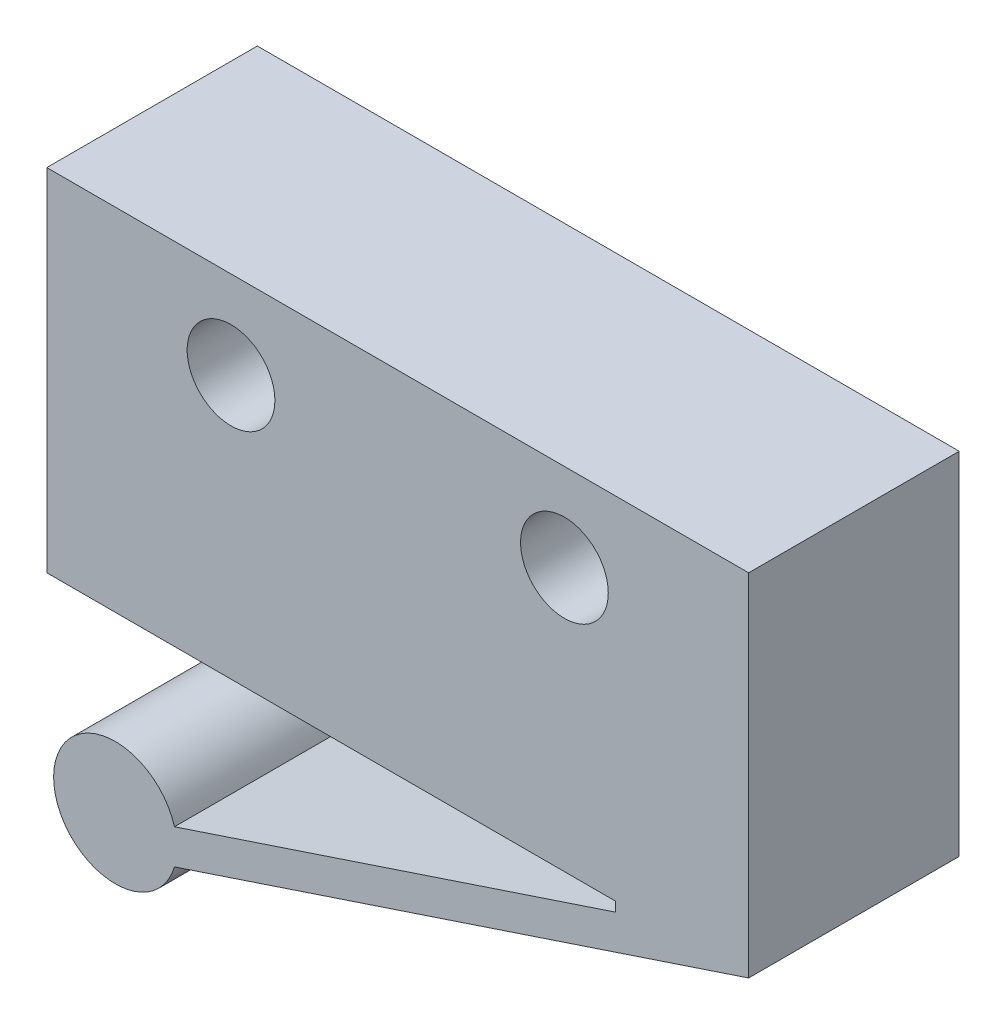
ISO-10303-21;
HEADER;
FILE_DESCRIPTION(('STEP AP214'),'2;1');
FILE_NAME('part.step','',(''),(''),'','','');
FILE_SCHEMA(('AUTOMOTIVE_DESIGN { 1 0 10303 214 1 1 1 1 }'));
ENDSEC;
DATA;
#1=APPLICATION_CONTEXT('core data for automotive mechanical design processes');
#2=APPLICATION_PROTOCOL_DEFINITION('international standard','automotive_design',2000,#1);
#3=PRODUCT_CONTEXT('',#1,'mechanical');
#4=PRODUCT('Part','Part','',(#3));
#5=PRODUCT_RELATED_PRODUCT_CATEGORY('part','',(#4));
#6=PRODUCT_DEFINITION_FORMATION('','',#4);
#7=PRODUCT_DEFINITION_CONTEXT('part definition',#1,'design');
#8=PRODUCT_DEFINITION('design','',#6,#7);
#9=PRODUCT_DEFINITION_SHAPE('','',#8);
#10=(LENGTH_UNIT() NAMED_UNIT(*) SI_UNIT(.MILLI.,.METRE.));
#11=(NAMED_UNIT(*) PLANE_ANGLE_UNIT() SI_UNIT($,.RADIAN.));
#12=(NAMED_UNIT(*) SI_UNIT($,.STERADIAN.) SOLID_ANGLE_UNIT());
#13=UNCERTAINTY_MEASURE_WITH_UNIT(LENGTH_MEASURE(1.E-05),#10,'distance_accuracy_value','');
#14=(GEOMETRIC_REPRESENTATION_CONTEXT(3) GLOBAL_UNCERTAINTY_ASSIGNED_CONTEXT((#13)) GLOBAL_UNIT_ASSIGNED_CONTEXT((#10,
#11,#12)) REPRESENTATION_CONTEXT('',''));
#15=CARTESIAN_POINT('',(0.,0.,0.));
#16=DIRECTION('',(0.,0.,1.));
#17=DIRECTION('',(1.,0.,0.));
#18=AXIS2_PLACEMENT_3D('',#15,#16,#17);
#19=CARTESIAN_POINT('',(-18.0482362713633,-14.9432240988429,6.));
#20=DIRECTION('',(0.,0.,1.));
#21=DIRECTION('',(1.,0.,0.));
#22=AXIS2_PLACEMENT_3D('',#19,#20,#21);
#23=PLANE('',#22);
#24=CARTESIAN_POINT('',(-14.75,-2.5,6.));
#25=DIRECTION('',(0.,0.,1.));
#26=DIRECTION('',(1.,0.,0.));
#27=AXIS2_PLACEMENT_3D('',#24,#25,#26);
#28=CIRCLE('',#27,1.25);
#29=CARTESIAN_POINT('',(-13.5,-2.5,6.));
#30=VERTEX_POINT('',#29);
#31=EDGE_CURVE('E135',#30,#30,#28,.T.);
#32=ORIENTED_EDGE('',*,*,#31,.F.);
#33=EDGE_LOOP('',(#32));
#34=FACE_BOUND('',#33,.T.);
#35=DIRECTION('',(0.,1.,0.));
#36=VECTOR('',#35,1.);
#37=CARTESIAN_POINT('',(0.,0.,6.));
#38=LINE('',#37,#36);
#39=CARTESIAN_POINT('',(0.,-10.,6.));
#40=VERTEX_POINT('',#39);
#41=CARTESIAN_POINT('',(0.,0.,6.));
#42=VERTEX_POINT('',#41);
#43=EDGE_CURVE('E146',#40,#42,#38,.T.);
#44=ORIENTED_EDGE('',*,*,#43,.T.);
#45=DIRECTION('',(-1.,0.,0.));
#46=VECTOR('',#45,1.);
#47=CARTESIAN_POINT('',(0.,0.,6.));
#48=LINE('',#47,#46);
#49=CARTESIAN_POINT('',(-20.,0.,6.));
#50=VERTEX_POINT('',#49);
#51=EDGE_CURVE('E94',#42,#50,#48,.T.);
#52=ORIENTED_EDGE('',*,*,#51,.T.);
#53=DIRECTION('',(0.,-1.,0.));
#54=VECTOR('',#53,1.);
#55=CARTESIAN_POINT('',(-20.,0.,6.));
#56=LINE('',#55,#54);
#57=CARTESIAN_POINT('',(-20.,-10.,6.));
#58=VERTEX_POINT('',#57);
#59=EDGE_CURVE('E161',#50,#58,#56,.T.);
#60=ORIENTED_EDGE('',*,*,#59,.T.);
#61=DIRECTION('',(1.,0.,0.));
#62=VECTOR('',#61,1.);
#63=CARTESIAN_POINT('',(-20.,-10.,6.));
#64=LINE('',#63,#62);
#65=CARTESIAN_POINT('',(-3.79315389070532,-10.,6.));
#66=VERTEX_POINT('',#65);
#67=EDGE_CURVE('E174',#58,#66,#64,.T.);
#68=ORIENTED_EDGE('',*,*,#67,.T.);
#69=DIRECTION('',(0.,-1.,0.));
#70=VECTOR('',#69,1.);
#71=CARTESIAN_POINT('',(-3.79315389070532,-10.,6.));
#72=LINE('',#71,#70);
#73=CARTESIAN_POINT('',(-3.79315389070532,-10.2709826001204,6.));
#74=VERTEX_POINT('',#73);
#75=EDGE_CURVE('E113',#66,#74,#72,.T.);
#76=ORIENTED_EDGE('',*,*,#75,.T.);
#77=DIRECTION('',(-0.948951208735798,-0.315422896186799,0.));
#78=VECTOR('',#77,1.);
#79=CARTESIAN_POINT('',(-3.79315389070532,-10.2709826001204,6.));
#80=LINE('',#79,#78);
#81=CARTESIAN_POINT('',(-16.3617348211214,-14.4486665121431,6.));
#82=VERTEX_POINT('',#81);
#83=EDGE_CURVE('E107',#74,#82,#80,.T.);
#84=ORIENTED_EDGE('',*,*,#83,.T.);
#85=CARTESIAN_POINT('',(-18.0482362713633,-14.9432240988429,6.));
#86=DIRECTION('',(0.,0.,1.));
#87=DIRECTION('',(1.,0.,0.));
#88=AXIS2_PLACEMENT_3D('',#85,#86,#87);
#89=CIRCLE('',#88,1.75751937350073);
#90=CARTESIAN_POINT('',(-16.361966597714,-15.4385713870769,6.));
#91=VERTEX_POINT('',#90);
#92=EDGE_CURVE('E111',#82,#91,#89,.T.);
#93=ORIENTED_EDGE('',*,*,#92,.T.);
#94=DIRECTION('',(0.948951208735798,0.315422896186799,0.));
#95=VECTOR('',#94,1.);
#96=CARTESIAN_POINT('',(-16.361966597714,-15.4385713870769,6.));
#97=LINE('',#96,#95);
#98=EDGE_CURVE('E51',#91,#40,#97,.T.);
#99=ORIENTED_EDGE('',*,*,#98,.T.);
#100=EDGE_LOOP('',(#44,#52,#60,#68,#76,#84,#93,#99));
#101=FACE_BOUND('',#100,.T.);
#102=CARTESIAN_POINT('',(-5.25,-2.5,6.));
#103=DIRECTION('',(0.,0.,1.));
#104=DIRECTION('',(1.,0.,0.));
#105=AXIS2_PLACEMENT_3D('',#102,#103,#104);
#106=CIRCLE('',#105,1.25);
#107=CARTESIAN_POINT('',(-4.,-2.5,6.));
#108=VERTEX_POINT('',#107);
#109=EDGE_CURVE('E183',#108,#108,#106,.T.);
#110=ORIENTED_EDGE('',*,*,#109,.F.);
#111=EDGE_LOOP('',(#110));
#112=FACE_BOUND('',#111,.T.);
#113=ADVANCED_FACE('F34',(#34,#101,#112),#23,.T.);
#114=CARTESIAN_POINT('',(-18.0482362713633,-14.9432240988429,0.));
#115=DIRECTION('',(0.,0.,1.));
#116=DIRECTION('',(1.,0.,0.));
#117=AXIS2_PLACEMENT_3D('',#114,#115,#116);
#118=PLANE('',#117);
#119=CARTESIAN_POINT('',(-14.75,-2.5,0.));
#120=DIRECTION('',(0.,0.,1.));
#121=DIRECTION('',(1.,0.,0.));
#122=AXIS2_PLACEMENT_3D('',#119,#120,#121);
#123=CIRCLE('',#122,1.25);
#124=CARTESIAN_POINT('',(-13.5,-2.5,0.));
#125=VERTEX_POINT('',#124);
#126=EDGE_CURVE('E180',#125,#125,#123,.T.);
#127=ORIENTED_EDGE('',*,*,#126,.T.);
#128=EDGE_LOOP('',(#127));
#129=FACE_BOUND('',#128,.T.);
#130=DIRECTION('',(0.,1.,0.));
#131=VECTOR('',#130,1.);
#132=CARTESIAN_POINT('',(0.,0.,0.));
#133=LINE('',#132,#131);
#134=CARTESIAN_POINT('',(0.,-10.,0.));
#135=VERTEX_POINT('',#134);
#136=CARTESIAN_POINT('',(0.,0.,0.));
#137=VERTEX_POINT('',#136);
#138=EDGE_CURVE('E131',#135,#137,#133,.T.);
#139=ORIENTED_EDGE('',*,*,#138,.F.);
#140=DIRECTION('',(0.948951208735798,0.315422896186799,0.));
#141=VECTOR('',#140,1.);
#142=CARTESIAN_POINT('',(-16.361966597714,-15.4385713870769,0.));
#143=LINE('',#142,#141);
#144=CARTESIAN_POINT('',(-16.361966597714,-15.4385713870769,0.));
#145=VERTEX_POINT('',#144);
#146=EDGE_CURVE('E86',#145,#135,#143,.T.);
#147=ORIENTED_EDGE('',*,*,#146,.F.);
#148=CARTESIAN_POINT('',(-18.0482362713633,-14.9432240988429,0.));
#149=DIRECTION('',(0.,0.,1.));
#150=DIRECTION('',(1.,0.,0.));
#151=AXIS2_PLACEMENT_3D('',#148,#149,#150);
#152=CIRCLE('',#151,1.75751937350073);
#153=CARTESIAN_POINT('',(-16.3617348211214,-14.4486665121431,0.));
#154=VERTEX_POINT('',#153);
#155=EDGE_CURVE('E80',#154,#145,#152,.T.);
#156=ORIENTED_EDGE('',*,*,#155,.F.);
#157=DIRECTION('',(-0.948951208735798,-0.315422896186799,0.));
#158=VECTOR('',#157,1.);
#159=CARTESIAN_POINT('',(-3.79315389070532,-10.2709826001204,0.));
#160=LINE('',#159,#158);
#161=CARTESIAN_POINT('',(-3.79315389070532,-10.2709826001204,0.));
#162=VERTEX_POINT('',#161);
#163=EDGE_CURVE('E121',#162,#154,#160,.T.);
#164=ORIENTED_EDGE('',*,*,#163,.F.);
#165=DIRECTION('',(0.,-1.,0.));
#166=VECTOR('',#165,1.);
#167=CARTESIAN_POINT('',(-3.79315389070532,-10.,0.));
#168=LINE('',#167,#166);
#169=CARTESIAN_POINT('',(-3.79315389070532,-10.,0.));
#170=VERTEX_POINT('',#169);
#171=EDGE_CURVE('E141',#170,#162,#168,.T.);
#172=ORIENTED_EDGE('',*,*,#171,.F.);
#173=DIRECTION('',(1.,0.,0.));
#174=VECTOR('',#173,1.);
#175=CARTESIAN_POINT('',(-20.,-10.,0.));
#176=LINE('',#175,#174);
#177=CARTESIAN_POINT('',(-20.,-10.,0.));
#178=VERTEX_POINT('',#177);
#179=EDGE_CURVE('E139',#178,#170,#176,.T.);
#180=ORIENTED_EDGE('',*,*,#179,.F.);
#181=DIRECTION('',(0.,-1.,0.));
#182=VECTOR('',#181,1.);
#183=CARTESIAN_POINT('',(-20.,0.,0.));
#184=LINE('',#183,#182);
#185=CARTESIAN_POINT('',(-20.,0.,0.));
#186=VERTEX_POINT('',#185);
#187=EDGE_CURVE('E137',#186,#178,#184,.T.);
#188=ORIENTED_EDGE('',*,*,#187,.F.);
#189=DIRECTION('',(-1.,0.,0.));
#190=VECTOR('',#189,1.);
#191=CARTESIAN_POINT('',(0.,0.,0.));
#192=LINE('',#191,#190);
#193=EDGE_CURVE('E134',#137,#186,#192,.T.);
#194=ORIENTED_EDGE('',*,*,#193,.F.);
#195=EDGE_LOOP('',(#139,#147,#156,#164,#172,#180,#188,#194));
#196=FACE_BOUND('',#195,.T.);
#197=CARTESIAN_POINT('',(-5.25,-2.5,0.));
#198=DIRECTION('',(0.,0.,1.));
#199=DIRECTION('',(1.,0.,0.));
#200=AXIS2_PLACEMENT_3D('',#197,#198,#199);
#201=CIRCLE('',#200,1.25);
#202=CARTESIAN_POINT('',(-4.,-2.5,0.));
#203=VERTEX_POINT('',#202);
#204=EDGE_CURVE('E186',#203,#203,#201,.T.);
#205=ORIENTED_EDGE('',*,*,#204,.T.);
#206=EDGE_LOOP('',(#205));
#207=FACE_BOUND('',#206,.T.);
#208=ADVANCED_FACE('F165',(#129,#196,#207),#118,.F.);
#209=CARTESIAN_POINT('',(0.,0.,6.));
#210=DIRECTION('',(-1.,0.,0.));
#211=DIRECTION('',(0.,-1.,0.));
#212=AXIS2_PLACEMENT_3D('',#209,#210,#211);
#213=PLANE('',#212);
#214=ORIENTED_EDGE('',*,*,#138,.T.);
#215=DIRECTION('',(0.,0.,-1.));
#216=VECTOR('',#215,1.);
#217=CARTESIAN_POINT('',(0.,0.,6.));
#218=LINE('',#217,#216);
#219=EDGE_CURVE('E11',#42,#137,#218,.T.);
#220=ORIENTED_EDGE('',*,*,#219,.F.);
#221=ORIENTED_EDGE('',*,*,#43,.F.);
#222=DIRECTION('',(0.,0.,-1.));
#223=VECTOR('',#222,1.);
#224=CARTESIAN_POINT('',(0.,-10.,6.));
#225=LINE('',#224,#223);
#226=EDGE_CURVE('E127',#40,#135,#225,.T.);
#227=ORIENTED_EDGE('',*,*,#226,.T.);
#228=EDGE_LOOP('',(#214,#220,#221,#227));
#229=FACE_BOUND('',#228,.T.);
#230=ADVANCED_FACE('F36',(#229),#213,.F.);
#231=CARTESIAN_POINT('',(0.,0.,6.));
#232=DIRECTION('',(0.,-1.,0.));
#233=DIRECTION('',(1.,0.,0.));
#234=AXIS2_PLACEMENT_3D('',#231,#232,#233);
#235=PLANE('',#234);
#236=ORIENTED_EDGE('',*,*,#193,.T.);
#237=DIRECTION('',(0.,0.,-1.));
#238=VECTOR('',#237,1.);
#239=CARTESIAN_POINT('',(-20.,0.,6.));
#240=LINE('',#239,#238);
#241=EDGE_CURVE('E43',#50,#186,#240,.T.);
#242=ORIENTED_EDGE('',*,*,#241,.F.);
#243=ORIENTED_EDGE('',*,*,#51,.F.);
#244=ORIENTED_EDGE('',*,*,#219,.T.);
#245=EDGE_LOOP('',(#236,#242,#243,#244));
#246=FACE_BOUND('',#245,.T.);
#247=ADVANCED_FACE('F219',(#246),#235,.F.);
#248=CARTESIAN_POINT('',(-20.,0.,6.));
#249=DIRECTION('',(1.,0.,0.));
#250=DIRECTION('',(0.,0.,-1.));
#251=AXIS2_PLACEMENT_3D('',#248,#249,#250);
#252=PLANE('',#251);
#253=ORIENTED_EDGE('',*,*,#187,.T.);
#254=DIRECTION('',(0.,0.,-1.));
#255=VECTOR('',#254,1.);
#256=CARTESIAN_POINT('',(-20.,-10.,6.));
#257=LINE('',#256,#255);
#258=EDGE_CURVE('E153',#58,#178,#257,.T.);
#259=ORIENTED_EDGE('',*,*,#258,.F.);
#260=ORIENTED_EDGE('',*,*,#59,.F.);
#261=ORIENTED_EDGE('',*,*,#241,.T.);
#262=EDGE_LOOP('',(#253,#259,#260,#261));
#263=FACE_BOUND('',#262,.T.);
#264=ADVANCED_FACE('F159',(#263),#252,.F.);
#265=CARTESIAN_POINT('',(-20.,-10.,6.));
#266=DIRECTION('',(0.,1.,0.));
#267=DIRECTION('',(0.,0.,1.));
#268=AXIS2_PLACEMENT_3D('',#265,#266,#267);
#269=PLANE('',#268);
#270=ORIENTED_EDGE('',*,*,#179,.T.);
#271=DIRECTION('',(0.,0.,-1.));
#272=VECTOR('',#271,1.);
#273=CARTESIAN_POINT('',(-3.79315389070532,-10.,6.));
#274=LINE('',#273,#272);
#275=EDGE_CURVE('E150',#66,#170,#274,.T.);
#276=ORIENTED_EDGE('',*,*,#275,.F.);
#277=ORIENTED_EDGE('',*,*,#67,.F.);
#278=ORIENTED_EDGE('',*,*,#258,.T.);
#279=EDGE_LOOP('',(#270,#276,#277,#278));
#280=FACE_BOUND('',#279,.T.);
#281=ADVANCED_FACE('F170',(#280),#269,.F.);
#282=CARTESIAN_POINT('',(-3.79315389070532,-10.,6.));
#283=DIRECTION('',(1.,0.,0.));
#284=DIRECTION('',(0.,0.,-1.));
#285=AXIS2_PLACEMENT_3D('',#282,#283,#284);
#286=PLANE('',#285);
#287=ORIENTED_EDGE('',*,*,#171,.T.);
#288=DIRECTION('',(0.,0.,-1.));
#289=VECTOR('',#288,1.);
#290=CARTESIAN_POINT('',(-3.79315389070532,-10.2709826001204,6.));
#291=LINE('',#290,#289);
#292=EDGE_CURVE('E122',#74,#162,#291,.T.);
#293=ORIENTED_EDGE('',*,*,#292,.F.);
#294=ORIENTED_EDGE('',*,*,#75,.F.);
#295=ORIENTED_EDGE('',*,*,#275,.T.);
#296=EDGE_LOOP('',(#287,#293,#294,#295));
#297=FACE_BOUND('',#296,.T.);
#298=ADVANCED_FACE('F173',(#297),#286,.F.);
#299=CARTESIAN_POINT('',(-3.79315389070532,-10.2709826001204,6.));
#300=DIRECTION('',(0.315422896186799,-0.948951208735798,0.));
#301=DIRECTION('',(0.948951208735798,0.315422896186799,0.));
#302=AXIS2_PLACEMENT_3D('',#299,#300,#301);
#303=PLANE('',#302);
#304=ORIENTED_EDGE('',*,*,#163,.T.);
#305=DIRECTION('',(0.,0.,-1.));
#306=VECTOR('',#305,1.);
#307=CARTESIAN_POINT('',(-16.3617348211214,-14.4486665121431,6.));
#308=LINE('',#307,#306);
#309=EDGE_CURVE('E118',#82,#154,#308,.T.);
#310=ORIENTED_EDGE('',*,*,#309,.F.);
#311=ORIENTED_EDGE('',*,*,#83,.F.);
#312=ORIENTED_EDGE('',*,*,#292,.T.);
#313=EDGE_LOOP('',(#304,#310,#311,#312));
#314=FACE_BOUND('',#313,.T.);
#315=ADVANCED_FACE('F119',(#314),#303,.F.);
#316=CARTESIAN_POINT('',(-18.0482362713633,-14.9432240988429,6.));
#317=DIRECTION('',(0.,0.,-1.));
#318=DIRECTION('',(-1.,0.,0.));
#319=AXIS2_PLACEMENT_3D('',#316,#317,#318);
#320=CYLINDRICAL_SURFACE('',#319,1.75751937350073);
#321=ORIENTED_EDGE('',*,*,#155,.T.);
#322=DIRECTION('',(0.,0.,-1.));
#323=VECTOR('',#322,1.);
#324=CARTESIAN_POINT('',(-16.361966597714,-15.4385713870769,6.));
#325=LINE('',#324,#323);
#326=EDGE_CURVE('E123',#91,#145,#325,.T.);
#327=ORIENTED_EDGE('',*,*,#326,.F.);
#328=ORIENTED_EDGE('',*,*,#92,.F.);
#329=ORIENTED_EDGE('',*,*,#309,.T.);
#330=EDGE_LOOP('',(#321,#327,#328,#329));
#331=FACE_BOUND('',#330,.T.);
#332=ADVANCED_FACE('F125',(#331),#320,.T.);
#333=CARTESIAN_POINT('',(-16.361966597714,-15.4385713870769,6.));
#334=DIRECTION('',(-0.315422896186799,0.948951208735798,0.));
#335=DIRECTION('',(-0.948951208735798,-0.315422896186799,0.));
#336=AXIS2_PLACEMENT_3D('',#333,#334,#335);
#337=PLANE('',#336);
#338=ORIENTED_EDGE('',*,*,#146,.T.);
#339=ORIENTED_EDGE('',*,*,#226,.F.);
#340=ORIENTED_EDGE('',*,*,#98,.F.);
#341=ORIENTED_EDGE('',*,*,#326,.T.);
#342=EDGE_LOOP('',(#338,#339,#340,#341));
#343=FACE_BOUND('',#342,.T.);
#344=ADVANCED_FACE('F207',(#343),#337,.F.);
#345=CARTESIAN_POINT('',(-14.75,-2.5,6.));
#346=DIRECTION('',(0.,0.,-1.));
#347=DIRECTION('',(-1.,0.,0.));
#348=AXIS2_PLACEMENT_3D('',#345,#346,#347);
#349=CYLINDRICAL_SURFACE('',#348,1.25);
#350=ORIENTED_EDGE('',*,*,#31,.T.);
#351=EDGE_LOOP('',(#350));
#352=FACE_BOUND('',#351,.T.);
#353=ORIENTED_EDGE('',*,*,#126,.F.);
#354=EDGE_LOOP('',(#353));
#355=FACE_BOUND('',#354,.T.);
#356=ADVANCED_FACE('F204',(#352,#355),#349,.F.);
#357=CARTESIAN_POINT('',(-5.25,-2.5,6.));
#358=DIRECTION('',(0.,0.,-1.));
#359=DIRECTION('',(-1.,0.,0.));
#360=AXIS2_PLACEMENT_3D('',#357,#358,#359);
#361=CYLINDRICAL_SURFACE('',#360,1.25);
#362=ORIENTED_EDGE('',*,*,#109,.T.);
#363=EDGE_LOOP('',(#362));
#364=FACE_BOUND('',#363,.T.);
#365=ORIENTED_EDGE('',*,*,#204,.F.);
#366=EDGE_LOOP('',(#365));
#367=FACE_BOUND('',#366,.T.);
#368=ADVANCED_FACE('F192',(#364,#367),#361,.F.);
#369=CLOSED_SHELL('',(#113,#208,#230,#247,#264,#281,#298,#315,#332,#344,#356,#368));
#370=MANIFOLD_SOLID_BREP('B2',#369);
#371=ADVANCED_BREP_SHAPE_REPRESENTATION('',(#18,#370),#14);
#372=SHAPE_DEFINITION_REPRESENTATION(#9,#371);
ENDSEC;
END-ISO-10303-21;
